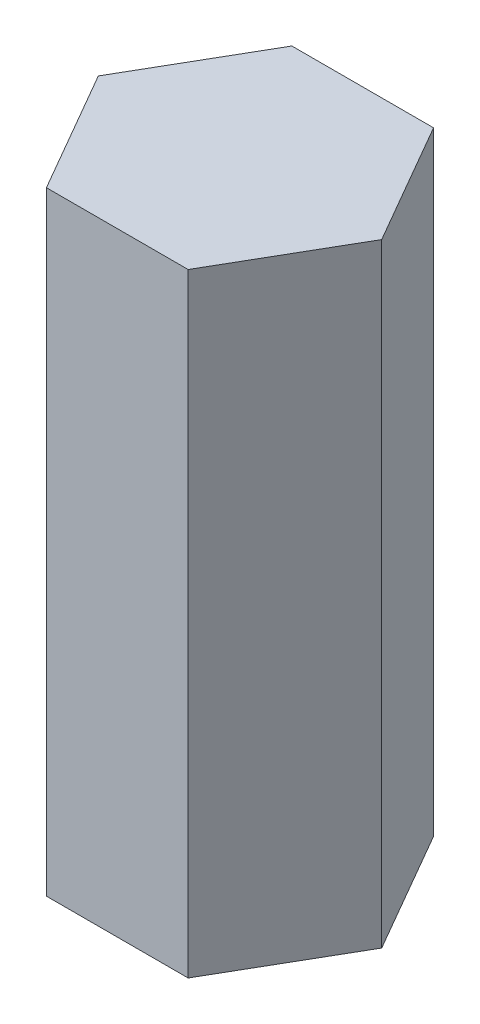
ISO-10303-21;
HEADER;
FILE_DESCRIPTION(('STEP AP214'),'2;1');
FILE_NAME('part.step','',(''),(''),'','','');
FILE_SCHEMA(('AUTOMOTIVE_DESIGN { 1 0 10303 214 1 1 1 1 }'));
ENDSEC;
DATA;
#1=APPLICATION_CONTEXT('core data for automotive mechanical design processes');
#2=APPLICATION_PROTOCOL_DEFINITION('international standard','automotive_design',2000,#1);
#3=PRODUCT_CONTEXT('',#1,'mechanical');
#4=PRODUCT('Part','Part','',(#3));
#5=PRODUCT_RELATED_PRODUCT_CATEGORY('part','',(#4));
#6=PRODUCT_DEFINITION_FORMATION('','',#4);
#7=PRODUCT_DEFINITION_CONTEXT('part definition',#1,'design');
#8=PRODUCT_DEFINITION('design','',#6,#7);
#9=PRODUCT_DEFINITION_SHAPE('','',#8);
#10=(LENGTH_UNIT() NAMED_UNIT(*) SI_UNIT(.MILLI.,.METRE.));
#11=(NAMED_UNIT(*) PLANE_ANGLE_UNIT() SI_UNIT($,.RADIAN.));
#12=(NAMED_UNIT(*) SI_UNIT($,.STERADIAN.) SOLID_ANGLE_UNIT());
#13=UNCERTAINTY_MEASURE_WITH_UNIT(LENGTH_MEASURE(1.E-05),#10,'distance_accuracy_value','');
#14=(GEOMETRIC_REPRESENTATION_CONTEXT(3) GLOBAL_UNCERTAINTY_ASSIGNED_CONTEXT((#13)) GLOBAL_UNIT_ASSIGNED_CONTEXT((#10,
#11,#12)) REPRESENTATION_CONTEXT('',''));
#15=CARTESIAN_POINT('',(0.,0.,0.));
#16=DIRECTION('',(0.,0.,1.));
#17=DIRECTION('',(1.,0.,0.));
#18=AXIS2_PLACEMENT_3D('',#15,#16,#17);
#19=CARTESIAN_POINT('',(3.2331615074619,14.,0.));
#20=DIRECTION('',(-0.866025403784439,0.,0.5));
#21=DIRECTION('',(0.5,0.,0.866025403784439));
#22=AXIS2_PLACEMENT_3D('',#19,#20,#21);
#23=PLANE('',#22);
#24=DIRECTION('',(-0.5,0.,-0.866025403784439));
#25=VECTOR('',#24,1.);
#26=CARTESIAN_POINT('',(3.2331615074619,0.,0.));
#27=LINE('',#26,#25);
#28=CARTESIAN_POINT('',(3.2331615074619,0.,0.));
#29=VERTEX_POINT('',#28);
#30=CARTESIAN_POINT('',(1.61658075373095,0.,-2.8));
#31=VERTEX_POINT('',#30);
#32=EDGE_CURVE('E116',#29,#31,#27,.T.);
#33=ORIENTED_EDGE('',*,*,#32,.T.);
#34=DIRECTION('',(0.,-1.,0.));
#35=VECTOR('',#34,1.);
#36=CARTESIAN_POINT('',(1.61658075373095,14.,-2.8));
#37=LINE('',#36,#35);
#38=CARTESIAN_POINT('',(1.61658075373095,14.,-2.8));
#39=VERTEX_POINT('',#38);
#40=EDGE_CURVE('E11',#39,#31,#37,.T.);
#41=ORIENTED_EDGE('',*,*,#40,.F.);
#42=DIRECTION('',(-0.5,0.,-0.866025403784439));
#43=VECTOR('',#42,1.);
#44=CARTESIAN_POINT('',(3.2331615074619,14.,0.));
#45=LINE('',#44,#43);
#46=CARTESIAN_POINT('',(3.2331615074619,14.,0.));
#47=VERTEX_POINT('',#46);
#48=EDGE_CURVE('E126',#47,#39,#45,.T.);
#49=ORIENTED_EDGE('',*,*,#48,.F.);
#50=DIRECTION('',(0.,-1.,0.));
#51=VECTOR('',#50,1.);
#52=CARTESIAN_POINT('',(3.2331615074619,14.,0.));
#53=LINE('',#52,#51);
#54=EDGE_CURVE('E112',#47,#29,#53,.T.);
#55=ORIENTED_EDGE('',*,*,#54,.T.);
#56=EDGE_LOOP('',(#33,#41,#49,#55));
#57=FACE_BOUND('',#56,.T.);
#58=ADVANCED_FACE('F32',(#57),#23,.F.);
#59=CARTESIAN_POINT('',(1.61658075373095,14.,-2.8));
#60=DIRECTION('',(0.,0.,1.));
#61=DIRECTION('',(1.,0.,0.));
#62=AXIS2_PLACEMENT_3D('',#59,#60,#61);
#63=PLANE('',#62);
#64=DIRECTION('',(-1.,0.,0.));
#65=VECTOR('',#64,1.);
#66=CARTESIAN_POINT('',(1.61658075373095,0.,-2.8));
#67=LINE('',#66,#65);
#68=CARTESIAN_POINT('',(-1.61658075373095,0.,-2.8));
#69=VERTEX_POINT('',#68);
#70=EDGE_CURVE('E119',#31,#69,#67,.T.);
#71=ORIENTED_EDGE('',*,*,#70,.T.);
#72=DIRECTION('',(0.,-1.,0.));
#73=VECTOR('',#72,1.);
#74=CARTESIAN_POINT('',(-1.61658075373095,14.,-2.8));
#75=LINE('',#74,#73);
#76=CARTESIAN_POINT('',(-1.61658075373095,14.,-2.8));
#77=VERTEX_POINT('',#76);
#78=EDGE_CURVE('E40',#77,#69,#75,.T.);
#79=ORIENTED_EDGE('',*,*,#78,.F.);
#80=DIRECTION('',(-1.,0.,0.));
#81=VECTOR('',#80,1.);
#82=CARTESIAN_POINT('',(1.61658075373095,14.,-2.8));
#83=LINE('',#82,#81);
#84=EDGE_CURVE('E85',#39,#77,#83,.T.);
#85=ORIENTED_EDGE('',*,*,#84,.F.);
#86=ORIENTED_EDGE('',*,*,#40,.T.);
#87=EDGE_LOOP('',(#71,#79,#85,#86));
#88=FACE_BOUND('',#87,.T.);
#89=ADVANCED_FACE('F150',(#88),#63,.F.);
#90=CARTESIAN_POINT('',(-1.61658075373095,14.,-2.8));
#91=DIRECTION('',(0.866025403784438,0.,0.5));
#92=DIRECTION('',(0.5,0.,-0.866025403784439));
#93=AXIS2_PLACEMENT_3D('',#90,#91,#92);
#94=PLANE('',#93);
#95=DIRECTION('',(-0.5,0.,0.866025403784438));
#96=VECTOR('',#95,1.);
#97=CARTESIAN_POINT('',(-1.61658075373095,0.,-2.8));
#98=LINE('',#97,#96);
#99=CARTESIAN_POINT('',(-3.2331615074619,0.,0.));
#100=VERTEX_POINT('',#99);
#101=EDGE_CURVE('E121',#69,#100,#98,.T.);
#102=ORIENTED_EDGE('',*,*,#101,.T.);
#103=DIRECTION('',(0.,-1.,0.));
#104=VECTOR('',#103,1.);
#105=CARTESIAN_POINT('',(-3.2331615074619,14.,0.));
#106=LINE('',#105,#104);
#107=CARTESIAN_POINT('',(-3.2331615074619,14.,0.));
#108=VERTEX_POINT('',#107);
#109=EDGE_CURVE('E107',#108,#100,#106,.T.);
#110=ORIENTED_EDGE('',*,*,#109,.F.);
#111=DIRECTION('',(-0.5,0.,0.866025403784438));
#112=VECTOR('',#111,1.);
#113=CARTESIAN_POINT('',(-1.61658075373095,14.,-2.8));
#114=LINE('',#113,#112);
#115=EDGE_CURVE('E98',#77,#108,#114,.T.);
#116=ORIENTED_EDGE('',*,*,#115,.F.);
#117=ORIENTED_EDGE('',*,*,#78,.T.);
#118=EDGE_LOOP('',(#102,#110,#116,#117));
#119=FACE_BOUND('',#118,.T.);
#120=ADVANCED_FACE('F132',(#119),#94,.F.);
#121=CARTESIAN_POINT('',(-3.2331615074619,14.,0.));
#122=DIRECTION('',(0.866025403784439,0.,-0.5));
#123=DIRECTION('',(-0.5,0.,-0.866025403784439));
#124=AXIS2_PLACEMENT_3D('',#121,#122,#123);
#125=PLANE('',#124);
#126=DIRECTION('',(0.5,0.,0.866025403784439));
#127=VECTOR('',#126,1.);
#128=CARTESIAN_POINT('',(-3.2331615074619,0.,0.));
#129=LINE('',#128,#127);
#130=CARTESIAN_POINT('',(-1.61658075373095,0.,2.8));
#131=VERTEX_POINT('',#130);
#132=EDGE_CURVE('E106',#100,#131,#129,.T.);
#133=ORIENTED_EDGE('',*,*,#132,.T.);
#134=DIRECTION('',(0.,-1.,0.));
#135=VECTOR('',#134,1.);
#136=CARTESIAN_POINT('',(-1.61658075373095,14.,2.8));
#137=LINE('',#136,#135);
#138=CARTESIAN_POINT('',(-1.61658075373095,14.,2.8));
#139=VERTEX_POINT('',#138);
#140=EDGE_CURVE('E103',#139,#131,#137,.T.);
#141=ORIENTED_EDGE('',*,*,#140,.F.);
#142=DIRECTION('',(0.5,0.,0.866025403784439));
#143=VECTOR('',#142,1.);
#144=CARTESIAN_POINT('',(-3.2331615074619,14.,0.));
#145=LINE('',#144,#143);
#146=EDGE_CURVE('E92',#108,#139,#145,.T.);
#147=ORIENTED_EDGE('',*,*,#146,.F.);
#148=ORIENTED_EDGE('',*,*,#109,.T.);
#149=EDGE_LOOP('',(#133,#141,#147,#148));
#150=FACE_BOUND('',#149,.T.);
#151=ADVANCED_FACE('F104',(#150),#125,.F.);
#152=CARTESIAN_POINT('',(-1.61658075373095,14.,2.8));
#153=DIRECTION('',(0.,0.,-1.));
#154=DIRECTION('',(-1.,0.,0.));
#155=AXIS2_PLACEMENT_3D('',#152,#153,#154);
#156=PLANE('',#155);
#157=DIRECTION('',(1.,0.,0.));
#158=VECTOR('',#157,1.);
#159=CARTESIAN_POINT('',(-1.61658075373095,0.,2.8));
#160=LINE('',#159,#158);
#161=CARTESIAN_POINT('',(1.61658075373095,0.,2.8));
#162=VERTEX_POINT('',#161);
#163=EDGE_CURVE('E71',#131,#162,#160,.T.);
#164=ORIENTED_EDGE('',*,*,#163,.T.);
#165=DIRECTION('',(0.,-1.,0.));
#166=VECTOR('',#165,1.);
#167=CARTESIAN_POINT('',(1.61658075373095,14.,2.8));
#168=LINE('',#167,#166);
#169=CARTESIAN_POINT('',(1.61658075373095,14.,2.8));
#170=VERTEX_POINT('',#169);
#171=EDGE_CURVE('E108',#170,#162,#168,.T.);
#172=ORIENTED_EDGE('',*,*,#171,.F.);
#173=DIRECTION('',(1.,0.,0.));
#174=VECTOR('',#173,1.);
#175=CARTESIAN_POINT('',(-1.61658075373095,14.,2.8));
#176=LINE('',#175,#174);
#177=EDGE_CURVE('E96',#139,#170,#176,.T.);
#178=ORIENTED_EDGE('',*,*,#177,.F.);
#179=ORIENTED_EDGE('',*,*,#140,.T.);
#180=EDGE_LOOP('',(#164,#172,#178,#179));
#181=FACE_BOUND('',#180,.T.);
#182=ADVANCED_FACE('F110',(#181),#156,.F.);
#183=CARTESIAN_POINT('',(1.61658075373095,14.,2.8));
#184=DIRECTION('',(-0.866025403784439,0.,-0.5));
#185=DIRECTION('',(-0.5,0.,0.866025403784439));
#186=AXIS2_PLACEMENT_3D('',#183,#184,#185);
#187=PLANE('',#186);
#188=DIRECTION('',(0.5,0.,-0.866025403784439));
#189=VECTOR('',#188,1.);
#190=CARTESIAN_POINT('',(1.61658075373095,0.,2.8));
#191=LINE('',#190,#189);
#192=EDGE_CURVE('E77',#162,#29,#191,.T.);
#193=ORIENTED_EDGE('',*,*,#192,.T.);
#194=ORIENTED_EDGE('',*,*,#54,.F.);
#195=DIRECTION('',(0.5,0.,-0.866025403784439));
#196=VECTOR('',#195,1.);
#197=CARTESIAN_POINT('',(1.61658075373095,14.,2.8));
#198=LINE('',#197,#196);
#199=EDGE_CURVE('E48',#170,#47,#198,.T.);
#200=ORIENTED_EDGE('',*,*,#199,.F.);
#201=ORIENTED_EDGE('',*,*,#171,.T.);
#202=EDGE_LOOP('',(#193,#194,#200,#201));
#203=FACE_BOUND('',#202,.T.);
#204=ADVANCED_FACE('F139',(#203),#187,.F.);
#205=CARTESIAN_POINT('',(0.,14.,0.));
#206=DIRECTION('',(0.,1.,0.));
#207=DIRECTION('',(0.,0.,1.));
#208=AXIS2_PLACEMENT_3D('',#205,#206,#207);
#209=PLANE('',#208);
#210=ORIENTED_EDGE('',*,*,#48,.T.);
#211=ORIENTED_EDGE('',*,*,#84,.T.);
#212=ORIENTED_EDGE('',*,*,#115,.T.);
#213=ORIENTED_EDGE('',*,*,#146,.T.);
#214=ORIENTED_EDGE('',*,*,#177,.T.);
#215=ORIENTED_EDGE('',*,*,#199,.T.);
#216=EDGE_LOOP('',(#210,#211,#212,#213,#214,#215));
#217=FACE_BOUND('',#216,.T.);
#218=ADVANCED_FACE('F94',(#217),#209,.T.);
#219=CARTESIAN_POINT('',(0.,0.,0.));
#220=DIRECTION('',(0.,1.,0.));
#221=DIRECTION('',(0.,0.,1.));
#222=AXIS2_PLACEMENT_3D('',#219,#220,#221);
#223=PLANE('',#222);
#224=ORIENTED_EDGE('',*,*,#32,.F.);
#225=ORIENTED_EDGE('',*,*,#192,.F.);
#226=ORIENTED_EDGE('',*,*,#163,.F.);
#227=ORIENTED_EDGE('',*,*,#132,.F.);
#228=ORIENTED_EDGE('',*,*,#101,.F.);
#229=ORIENTED_EDGE('',*,*,#70,.F.);
#230=EDGE_LOOP('',(#224,#225,#226,#227,#228,#229));
#231=FACE_BOUND('',#230,.T.);
#232=ADVANCED_FACE('F135',(#231),#223,.F.);
#233=CLOSED_SHELL('',(#58,#89,#120,#151,#182,#204,#218,#232));
#234=MANIFOLD_SOLID_BREP('B2',#233);
#235=ADVANCED_BREP_SHAPE_REPRESENTATION('',(#18,#234),#14);
#236=SHAPE_DEFINITION_REPRESENTATION(#9,#235);
ENDSEC;
END-ISO-10303-21;
